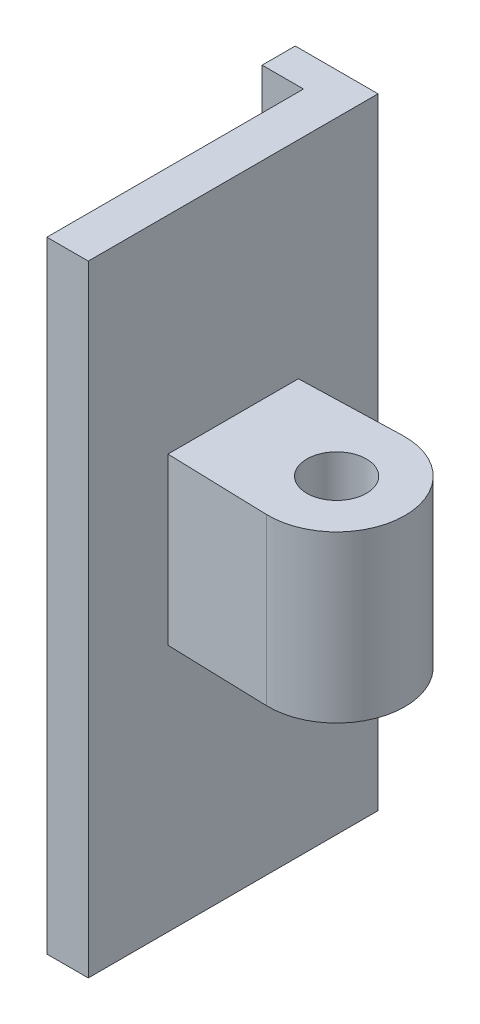
ISO-10303-21;
HEADER;
FILE_DESCRIPTION(('STEP AP214'),'2;1');
FILE_NAME('part.step','',(''),(''),'','','');
FILE_SCHEMA(('AUTOMOTIVE_DESIGN { 1 0 10303 214 1 1 1 1 }'));
ENDSEC;
DATA;
#1=APPLICATION_CONTEXT('core data for automotive mechanical design processes');
#2=APPLICATION_PROTOCOL_DEFINITION('international standard','automotive_design',2000,#1);
#3=PRODUCT_CONTEXT('',#1,'mechanical');
#4=PRODUCT('Part','Part','',(#3));
#5=PRODUCT_RELATED_PRODUCT_CATEGORY('part','',(#4));
#6=PRODUCT_DEFINITION_FORMATION('','',#4);
#7=PRODUCT_DEFINITION_CONTEXT('part definition',#1,'design');
#8=PRODUCT_DEFINITION('design','',#6,#7);
#9=PRODUCT_DEFINITION_SHAPE('','',#8);
#10=(LENGTH_UNIT() NAMED_UNIT(*) SI_UNIT(.MILLI.,.METRE.));
#11=(NAMED_UNIT(*) PLANE_ANGLE_UNIT() SI_UNIT($,.RADIAN.));
#12=(NAMED_UNIT(*) SI_UNIT($,.STERADIAN.) SOLID_ANGLE_UNIT());
#13=UNCERTAINTY_MEASURE_WITH_UNIT(LENGTH_MEASURE(1.E-05),#10,'distance_accuracy_value','');
#14=(GEOMETRIC_REPRESENTATION_CONTEXT(3) GLOBAL_UNCERTAINTY_ASSIGNED_CONTEXT((#13)) GLOBAL_UNIT_ASSIGNED_CONTEXT((#10,
#11,#12)) REPRESENTATION_CONTEXT('',''));
#15=CARTESIAN_POINT('',(0.,0.,0.));
#16=DIRECTION('',(0.,0.,1.));
#17=DIRECTION('',(1.,0.,0.));
#18=AXIS2_PLACEMENT_3D('',#15,#16,#17);
#19=CARTESIAN_POINT('',(2.5,-8.25,0.));
#20=DIRECTION('',(0.,-1.,0.));
#21=DIRECTION('',(0.,0.,-1.));
#22=AXIS2_PLACEMENT_3D('',#19,#20,#21);
#23=CYLINDRICAL_SURFACE('',#22,0.36);
#24=CARTESIAN_POINT('',(2.5,-8.25,0.));
#25=DIRECTION('',(0.,1.,0.));
#26=DIRECTION('',(0.,0.,1.));
#27=AXIS2_PLACEMENT_3D('',#24,#25,#26);
#28=CIRCLE('',#27,0.36);
#29=CARTESIAN_POINT('',(2.5,-8.25,0.360000000000001));
#30=VERTEX_POINT('',#29);
#31=EDGE_CURVE('E176',#30,#30,#28,.T.);
#32=ORIENTED_EDGE('',*,*,#31,.T.);
#33=EDGE_LOOP('',(#32));
#34=FACE_BOUND('',#33,.T.);
#35=CARTESIAN_POINT('',(2.5,-10.25,0.));
#36=DIRECTION('',(0.,1.,0.));
#37=DIRECTION('',(0.,0.,1.));
#38=AXIS2_PLACEMENT_3D('',#35,#36,#37);
#39=CIRCLE('',#38,0.36);
#40=CARTESIAN_POINT('',(2.5,-10.25,0.360000000000001));
#41=VERTEX_POINT('',#40);
#42=EDGE_CURVE('E146',#41,#41,#39,.T.);
#43=ORIENTED_EDGE('',*,*,#42,.F.);
#44=EDGE_LOOP('',(#43));
#45=FACE_BOUND('',#44,.T.);
#46=ADVANCED_FACE('F33',(#34,#45),#23,.F.);
#47=CARTESIAN_POINT('',(0.750000000000001,-8.25,1.75));
#48=DIRECTION('',(1.,0.,0.));
#49=DIRECTION('',(0.,0.,-1.));
#50=AXIS2_PLACEMENT_3D('',#47,#48,#49);
#51=PLANE('',#50);
#52=DIRECTION('',(0.,1.,0.));
#53=VECTOR('',#52,1.);
#54=CARTESIAN_POINT('',(0.750000000000001,-5.75,-1.35));
#55=LINE('',#54,#53);
#56=CARTESIAN_POINT('',(0.750000000000001,-13.25,-1.35));
#57=VERTEX_POINT('',#56);
#58=CARTESIAN_POINT('',(0.750000000000001,-5.75,-1.35));
#59=VERTEX_POINT('',#58);
#60=EDGE_CURVE('E48',#57,#59,#55,.T.);
#61=ORIENTED_EDGE('',*,*,#60,.F.);
#62=DIRECTION('',(0.,0.,1.));
#63=VECTOR('',#62,1.);
#64=CARTESIAN_POINT('',(0.750000000000001,-13.25,-1.75));
#65=LINE('',#64,#63);
#66=CARTESIAN_POINT('',(0.750000000000001,-13.25,1.75));
#67=VERTEX_POINT('',#66);
#68=EDGE_CURVE('E161',#57,#67,#65,.T.);
#69=ORIENTED_EDGE('',*,*,#68,.T.);
#70=DIRECTION('',(0.,-1.,0.));
#71=VECTOR('',#70,1.);
#72=CARTESIAN_POINT('',(0.750000000000001,-8.25,1.75));
#73=LINE('',#72,#71);
#74=CARTESIAN_POINT('',(0.750000000000001,-5.75,1.75));
#75=VERTEX_POINT('',#74);
#76=EDGE_CURVE('E196',#75,#67,#73,.T.);
#77=ORIENTED_EDGE('',*,*,#76,.F.);
#78=DIRECTION('',(0.,0.,1.));
#79=VECTOR('',#78,1.);
#80=CARTESIAN_POINT('',(0.750000000000001,-5.75,-1.75));
#81=LINE('',#80,#79);
#82=EDGE_CURVE('E156',#59,#75,#81,.T.);
#83=ORIENTED_EDGE('',*,*,#82,.F.);
#84=EDGE_LOOP('',(#61,#69,#77,#83));
#85=FACE_BOUND('',#84,.T.);
#86=ADVANCED_FACE('F225',(#85),#51,.F.);
#87=CARTESIAN_POINT('',(2.5,-8.25,0.));
#88=DIRECTION('',(0.,1.,0.));
#89=DIRECTION('',(0.,0.,1.));
#90=AXIS2_PLACEMENT_3D('',#87,#88,#89);
#91=PLANE('',#90);
#92=DIRECTION('',(0.,0.,-1.));
#93=VECTOR('',#92,1.);
#94=CARTESIAN_POINT('',(1.25,-8.25,0.));
#95=LINE('',#94,#93);
#96=CARTESIAN_POINT('',(1.25,-8.25,0.78768744273324));
#97=VERTEX_POINT('',#96);
#98=CARTESIAN_POINT('',(1.25,-8.25,-0.787687442733241));
#99=VERTEX_POINT('',#98);
#100=EDGE_CURVE('E173',#97,#99,#95,.T.);
#101=ORIENTED_EDGE('',*,*,#100,.F.);
#102=DIRECTION('',(0.99954579976556,0.,0.0301362600703332));
#103=VECTOR('',#102,1.);
#104=CARTESIAN_POINT('',(2.47513758544198,-8.25,0.824625284806589));
#105=LINE('',#104,#103);
#106=CARTESIAN_POINT('',(2.47513758544198,-8.25,0.824625284806589));
#107=VERTEX_POINT('',#106);
#108=EDGE_CURVE('E57',#97,#107,#105,.T.);
#109=ORIENTED_EDGE('',*,*,#108,.T.);
#110=CARTESIAN_POINT('',(2.5,-8.25,0.));
#111=DIRECTION('',(0.,1.,0.));
#112=DIRECTION('',(0.,0.,1.));
#113=AXIS2_PLACEMENT_3D('',#110,#111,#112);
#114=CIRCLE('',#113,0.825000000000001);
#115=CARTESIAN_POINT('',(2.47513758544198,-8.25,-0.824625284806588));
#116=VERTEX_POINT('',#115);
#117=EDGE_CURVE('E180',#107,#116,#114,.T.);
#118=ORIENTED_EDGE('',*,*,#117,.T.);
#119=DIRECTION('',(-0.99954579976556,0.,0.0301362600703313));
#120=VECTOR('',#119,1.);
#121=CARTESIAN_POINT('',(1.25,-8.25,-0.787687442733241));
#122=LINE('',#121,#120);
#123=EDGE_CURVE('E79',#116,#99,#122,.T.);
#124=ORIENTED_EDGE('',*,*,#123,.T.);
#125=EDGE_LOOP('',(#101,#109,#118,#124));
#126=FACE_BOUND('',#125,.T.);
#127=ORIENTED_EDGE('',*,*,#31,.F.);
#128=EDGE_LOOP('',(#127));
#129=FACE_BOUND('',#128,.T.);
#130=ADVANCED_FACE('F233',(#126,#129),#91,.T.);
#131=CARTESIAN_POINT('',(2.5,-10.25,0.));
#132=DIRECTION('',(0.,1.,0.));
#133=DIRECTION('',(0.,0.,1.));
#134=AXIS2_PLACEMENT_3D('',#131,#132,#133);
#135=PLANE('',#134);
#136=DIRECTION('',(0.99954579976556,0.,0.0301362600703332));
#137=VECTOR('',#136,1.);
#138=CARTESIAN_POINT('',(2.47513758544198,-10.25,0.824625284806589));
#139=LINE('',#138,#137);
#140=CARTESIAN_POINT('',(1.25,-10.25,0.78768744273324));
#141=VERTEX_POINT('',#140);
#142=CARTESIAN_POINT('',(2.47513758544198,-10.25,0.824625284806589));
#143=VERTEX_POINT('',#142);
#144=EDGE_CURVE('E72',#141,#143,#139,.T.);
#145=ORIENTED_EDGE('',*,*,#144,.F.);
#146=DIRECTION('',(0.,0.,-1.));
#147=VECTOR('',#146,1.);
#148=CARTESIAN_POINT('',(1.25,-10.25,0.));
#149=LINE('',#148,#147);
#150=CARTESIAN_POINT('',(1.25,-10.25,-0.787687442733241));
#151=VERTEX_POINT('',#150);
#152=EDGE_CURVE('E171',#141,#151,#149,.T.);
#153=ORIENTED_EDGE('',*,*,#152,.T.);
#154=DIRECTION('',(-0.99954579976556,0.,0.0301362600703313));
#155=VECTOR('',#154,1.);
#156=CARTESIAN_POINT('',(1.25,-10.25,-0.787687442733241));
#157=LINE('',#156,#155);
#158=CARTESIAN_POINT('',(2.47513758544198,-10.25,-0.824625284806588));
#159=VERTEX_POINT('',#158);
#160=EDGE_CURVE('E187',#159,#151,#157,.T.);
#161=ORIENTED_EDGE('',*,*,#160,.F.);
#162=CARTESIAN_POINT('',(2.5,-10.25,0.));
#163=DIRECTION('',(0.,1.,0.));
#164=DIRECTION('',(0.,0.,1.));
#165=AXIS2_PLACEMENT_3D('',#162,#163,#164);
#166=CIRCLE('',#165,0.825000000000001);
#167=EDGE_CURVE('E179',#143,#159,#166,.T.);
#168=ORIENTED_EDGE('',*,*,#167,.F.);
#169=EDGE_LOOP('',(#145,#153,#161,#168));
#170=FACE_BOUND('',#169,.T.);
#171=ORIENTED_EDGE('',*,*,#42,.T.);
#172=EDGE_LOOP('',(#171));
#173=FACE_BOUND('',#172,.T.);
#174=ADVANCED_FACE('F208',(#170,#173),#135,.F.);
#175=CARTESIAN_POINT('',(2.5,-8.25,0.));
#176=DIRECTION('',(0.,-1.,0.));
#177=DIRECTION('',(0.,0.,-1.));
#178=AXIS2_PLACEMENT_3D('',#175,#176,#177);
#179=CYLINDRICAL_SURFACE('',#178,0.825000000000001);
#180=ORIENTED_EDGE('',*,*,#167,.T.);
#181=DIRECTION('',(0.,-1.,0.));
#182=VECTOR('',#181,1.);
#183=CARTESIAN_POINT('',(2.47513758544198,-8.25,-0.824625284806588));
#184=LINE('',#183,#182);
#185=EDGE_CURVE('E11',#116,#159,#184,.T.);
#186=ORIENTED_EDGE('',*,*,#185,.F.);
#187=ORIENTED_EDGE('',*,*,#117,.F.);
#188=DIRECTION('',(0.,-1.,0.));
#189=VECTOR('',#188,1.);
#190=CARTESIAN_POINT('',(2.47513758544198,-8.25,0.824625284806589));
#191=LINE('',#190,#189);
#192=EDGE_CURVE('E184',#107,#143,#191,.T.);
#193=ORIENTED_EDGE('',*,*,#192,.T.);
#194=EDGE_LOOP('',(#180,#186,#187,#193));
#195=FACE_BOUND('',#194,.T.);
#196=ADVANCED_FACE('F35',(#195),#179,.T.);
#197=CARTESIAN_POINT('',(1.25,-8.25,-0.787687442733241));
#198=DIRECTION('',(0.0301362600703313,0.,0.99954579976556));
#199=DIRECTION('',(0.99954579976556,0.,-0.0301362600703313));
#200=AXIS2_PLACEMENT_3D('',#197,#198,#199);
#201=PLANE('',#200);
#202=ORIENTED_EDGE('',*,*,#160,.T.);
#203=DIRECTION('',(0.,-1.,0.));
#204=VECTOR('',#203,1.);
#205=CARTESIAN_POINT('',(1.25,-8.25,-0.787687442733241));
#206=LINE('',#205,#204);
#207=EDGE_CURVE('E41',#99,#151,#206,.T.);
#208=ORIENTED_EDGE('',*,*,#207,.F.);
#209=ORIENTED_EDGE('',*,*,#123,.F.);
#210=ORIENTED_EDGE('',*,*,#185,.T.);
#211=EDGE_LOOP('',(#202,#208,#209,#210));
#212=FACE_BOUND('',#211,.T.);
#213=ADVANCED_FACE('F204',(#212),#201,.F.);
#214=CARTESIAN_POINT('',(0.750000000000001,-8.25,-1.75));
#215=DIRECTION('',(0.,0.,1.));
#216=DIRECTION('',(1.,0.,0.));
#217=AXIS2_PLACEMENT_3D('',#214,#215,#216);
#218=PLANE('',#217);
#219=DIRECTION('',(0.,-1.,0.));
#220=VECTOR('',#219,1.);
#221=CARTESIAN_POINT('',(1.25,-8.25,-1.75));
#222=LINE('',#221,#220);
#223=CARTESIAN_POINT('',(1.25,-5.75,-1.75));
#224=VERTEX_POINT('',#223);
#225=CARTESIAN_POINT('',(1.25,-13.25,-1.75));
#226=VERTEX_POINT('',#225);
#227=EDGE_CURVE('E125',#224,#226,#222,.T.);
#228=ORIENTED_EDGE('',*,*,#227,.T.);
#229=DIRECTION('',(-1.,0.,0.));
#230=VECTOR('',#229,1.);
#231=CARTESIAN_POINT('',(1.25,-13.25,-1.75));
#232=LINE('',#231,#230);
#233=CARTESIAN_POINT('',(0.250000000000001,-13.25,-1.75));
#234=VERTEX_POINT('',#233);
#235=EDGE_CURVE('E119',#226,#234,#232,.T.);
#236=ORIENTED_EDGE('',*,*,#235,.T.);
#237=DIRECTION('',(0.,-1.,0.));
#238=VECTOR('',#237,1.);
#239=CARTESIAN_POINT('',(0.250000000000001,-5.75,-1.75));
#240=LINE('',#239,#238);
#241=CARTESIAN_POINT('',(0.250000000000001,-5.75,-1.75));
#242=VERTEX_POINT('',#241);
#243=EDGE_CURVE('E124',#242,#234,#240,.T.);
#244=ORIENTED_EDGE('',*,*,#243,.F.);
#245=DIRECTION('',(-1.,0.,0.));
#246=VECTOR('',#245,1.);
#247=CARTESIAN_POINT('',(1.25,-5.75,-1.75));
#248=LINE('',#247,#246);
#249=EDGE_CURVE('E130',#224,#242,#248,.T.);
#250=ORIENTED_EDGE('',*,*,#249,.F.);
#251=EDGE_LOOP('',(#228,#236,#244,#250));
#252=FACE_BOUND('',#251,.T.);
#253=ADVANCED_FACE('F121',(#252),#218,.F.);
#254=CARTESIAN_POINT('',(1.25,-8.25,1.75));
#255=DIRECTION('',(0.,0.,-1.));
#256=DIRECTION('',(-1.,0.,0.));
#257=AXIS2_PLACEMENT_3D('',#254,#255,#256);
#258=PLANE('',#257);
#259=ORIENTED_EDGE('',*,*,#76,.T.);
#260=DIRECTION('',(-1.,0.,0.));
#261=VECTOR('',#260,1.);
#262=CARTESIAN_POINT('',(1.25,-13.25,1.75));
#263=LINE('',#262,#261);
#264=CARTESIAN_POINT('',(1.25,-13.25,1.75));
#265=VERTEX_POINT('',#264);
#266=EDGE_CURVE('E129',#265,#67,#263,.T.);
#267=ORIENTED_EDGE('',*,*,#266,.F.);
#268=DIRECTION('',(0.,-1.,0.));
#269=VECTOR('',#268,1.);
#270=CARTESIAN_POINT('',(1.25,-8.25,1.75));
#271=LINE('',#270,#269);
#272=CARTESIAN_POINT('',(1.25,-5.75,1.75));
#273=VERTEX_POINT('',#272);
#274=EDGE_CURVE('E194',#273,#265,#271,.T.);
#275=ORIENTED_EDGE('',*,*,#274,.F.);
#276=DIRECTION('',(-1.,0.,0.));
#277=VECTOR('',#276,1.);
#278=CARTESIAN_POINT('',(1.25,-5.75,1.75));
#279=LINE('',#278,#277);
#280=EDGE_CURVE('E168',#273,#75,#279,.T.);
#281=ORIENTED_EDGE('',*,*,#280,.T.);
#282=EDGE_LOOP('',(#259,#267,#275,#281));
#283=FACE_BOUND('',#282,.T.);
#284=ADVANCED_FACE('F221',(#283),#258,.F.);
#285=CARTESIAN_POINT('',(1.25,-8.25,0.78768744273324));
#286=DIRECTION('',(-1.,0.,0.));
#287=DIRECTION('',(0.,0.,1.));
#288=AXIS2_PLACEMENT_3D('',#285,#286,#287);
#289=PLANE('',#288);
#290=DIRECTION('',(0.,-1.,0.));
#291=VECTOR('',#290,1.);
#292=CARTESIAN_POINT('',(1.25,-8.25,0.78768744273324));
#293=LINE('',#292,#291);
#294=EDGE_CURVE('E192',#97,#141,#293,.T.);
#295=ORIENTED_EDGE('',*,*,#294,.F.);
#296=ORIENTED_EDGE('',*,*,#100,.T.);
#297=ORIENTED_EDGE('',*,*,#207,.T.);
#298=ORIENTED_EDGE('',*,*,#152,.F.);
#299=EDGE_LOOP('',(#295,#296,#297,#298));
#300=FACE_BOUND('',#299,.T.);
#301=ORIENTED_EDGE('',*,*,#274,.T.);
#302=DIRECTION('',(0.,0.,1.));
#303=VECTOR('',#302,1.);
#304=CARTESIAN_POINT('',(1.25,-13.25,-1.75));
#305=LINE('',#304,#303);
#306=EDGE_CURVE('E160',#226,#265,#305,.T.);
#307=ORIENTED_EDGE('',*,*,#306,.F.);
#308=ORIENTED_EDGE('',*,*,#227,.F.);
#309=DIRECTION('',(0.,0.,1.));
#310=VECTOR('',#309,1.);
#311=CARTESIAN_POINT('',(1.25,-5.75,-1.75));
#312=LINE('',#311,#310);
#313=EDGE_CURVE('E157',#224,#273,#312,.T.);
#314=ORIENTED_EDGE('',*,*,#313,.T.);
#315=EDGE_LOOP('',(#301,#307,#308,#314));
#316=FACE_BOUND('',#315,.T.);
#317=ADVANCED_FACE('F202',(#300,#316),#289,.F.);
#318=CARTESIAN_POINT('',(2.47513758544198,-8.25,0.824625284806589));
#319=DIRECTION('',(0.0301362600703332,0.,-0.99954579976556));
#320=DIRECTION('',(-0.99954579976556,0.,-0.0301362600703332));
#321=AXIS2_PLACEMENT_3D('',#318,#319,#320);
#322=PLANE('',#321);
#323=ORIENTED_EDGE('',*,*,#144,.T.);
#324=ORIENTED_EDGE('',*,*,#192,.F.);
#325=ORIENTED_EDGE('',*,*,#108,.F.);
#326=ORIENTED_EDGE('',*,*,#294,.T.);
#327=EDGE_LOOP('',(#323,#324,#325,#326));
#328=FACE_BOUND('',#327,.T.);
#329=ADVANCED_FACE('F212',(#328),#322,.F.);
#330=CARTESIAN_POINT('',(1.25,-13.25,-1.75));
#331=DIRECTION('',(0.,-1.,0.));
#332=DIRECTION('',(1.,0.,0.));
#333=AXIS2_PLACEMENT_3D('',#330,#331,#332);
#334=PLANE('',#333);
#335=ORIENTED_EDGE('',*,*,#68,.F.);
#336=DIRECTION('',(1.,0.,0.));
#337=VECTOR('',#336,1.);
#338=CARTESIAN_POINT('',(0.250000000000001,-13.25,-1.35));
#339=LINE('',#338,#337);
#340=CARTESIAN_POINT('',(0.250000000000001,-13.25,-1.35));
#341=VERTEX_POINT('',#340);
#342=EDGE_CURVE('E136',#341,#57,#339,.T.);
#343=ORIENTED_EDGE('',*,*,#342,.F.);
#344=DIRECTION('',(0.,0.,1.));
#345=VECTOR('',#344,1.);
#346=CARTESIAN_POINT('',(0.250000000000001,-13.25,-1.75));
#347=LINE('',#346,#345);
#348=EDGE_CURVE('E133',#234,#341,#347,.T.);
#349=ORIENTED_EDGE('',*,*,#348,.F.);
#350=ORIENTED_EDGE('',*,*,#235,.F.);
#351=ORIENTED_EDGE('',*,*,#306,.T.);
#352=ORIENTED_EDGE('',*,*,#266,.T.);
#353=EDGE_LOOP('',(#335,#343,#349,#350,#351,#352));
#354=FACE_BOUND('',#353,.T.);
#355=ADVANCED_FACE('F134',(#354),#334,.T.);
#356=CARTESIAN_POINT('',(1.25,-5.75,-1.75));
#357=DIRECTION('',(0.,-1.,0.));
#358=DIRECTION('',(1.,0.,0.));
#359=AXIS2_PLACEMENT_3D('',#356,#357,#358);
#360=PLANE('',#359);
#361=ORIENTED_EDGE('',*,*,#249,.T.);
#362=DIRECTION('',(0.,0.,-1.));
#363=VECTOR('',#362,1.);
#364=CARTESIAN_POINT('',(0.250000000000001,-5.75,-1.75));
#365=LINE('',#364,#363);
#366=CARTESIAN_POINT('',(0.250000000000001,-5.75,-1.35));
#367=VERTEX_POINT('',#366);
#368=EDGE_CURVE('E144',#367,#242,#365,.T.);
#369=ORIENTED_EDGE('',*,*,#368,.F.);
#370=DIRECTION('',(1.,0.,0.));
#371=VECTOR('',#370,1.);
#372=CARTESIAN_POINT('',(0.250000000000001,-5.75,-1.35));
#373=LINE('',#372,#371);
#374=EDGE_CURVE('E151',#367,#59,#373,.T.);
#375=ORIENTED_EDGE('',*,*,#374,.T.);
#376=ORIENTED_EDGE('',*,*,#82,.T.);
#377=ORIENTED_EDGE('',*,*,#280,.F.);
#378=ORIENTED_EDGE('',*,*,#313,.F.);
#379=EDGE_LOOP('',(#361,#369,#375,#376,#377,#378));
#380=FACE_BOUND('',#379,.T.);
#381=ADVANCED_FACE('F219',(#380),#360,.F.);
#382=CARTESIAN_POINT('',(0.250000000000001,-5.75,-1.35));
#383=DIRECTION('',(0.,0.,-1.));
#384=DIRECTION('',(0.,1.,0.));
#385=AXIS2_PLACEMENT_3D('',#382,#383,#384);
#386=PLANE('',#385);
#387=ORIENTED_EDGE('',*,*,#60,.T.);
#388=ORIENTED_EDGE('',*,*,#374,.F.);
#389=DIRECTION('',(0.,1.,0.));
#390=VECTOR('',#389,1.);
#391=CARTESIAN_POINT('',(0.250000000000001,-5.75,-1.35));
#392=LINE('',#391,#390);
#393=EDGE_CURVE('E139',#341,#367,#392,.T.);
#394=ORIENTED_EDGE('',*,*,#393,.F.);
#395=ORIENTED_EDGE('',*,*,#342,.T.);
#396=EDGE_LOOP('',(#387,#388,#394,#395));
#397=FACE_BOUND('',#396,.T.);
#398=ADVANCED_FACE('F261',(#397),#386,.F.);
#399=CARTESIAN_POINT('',(0.250000000000001,0.,0.));
#400=DIRECTION('',(-1.,0.,0.));
#401=DIRECTION('',(0.,0.,1.));
#402=AXIS2_PLACEMENT_3D('',#399,#400,#401);
#403=PLANE('',#402);
#404=ORIENTED_EDGE('',*,*,#243,.T.);
#405=ORIENTED_EDGE('',*,*,#348,.T.);
#406=ORIENTED_EDGE('',*,*,#393,.T.);
#407=ORIENTED_EDGE('',*,*,#368,.T.);
#408=EDGE_LOOP('',(#404,#405,#406,#407));
#409=FACE_BOUND('',#408,.T.);
#410=ADVANCED_FACE('F142',(#409),#403,.T.);
#411=CLOSED_SHELL('',(#46,#86,#130,#174,#196,#213,#253,#284,#317,#329,#355,#381,#398,#410));
#412=MANIFOLD_SOLID_BREP('B2',#411);
#413=ADVANCED_BREP_SHAPE_REPRESENTATION('',(#18,#412),#14);
#414=SHAPE_DEFINITION_REPRESENTATION(#9,#413);
ENDSEC;
END-ISO-10303-21;
